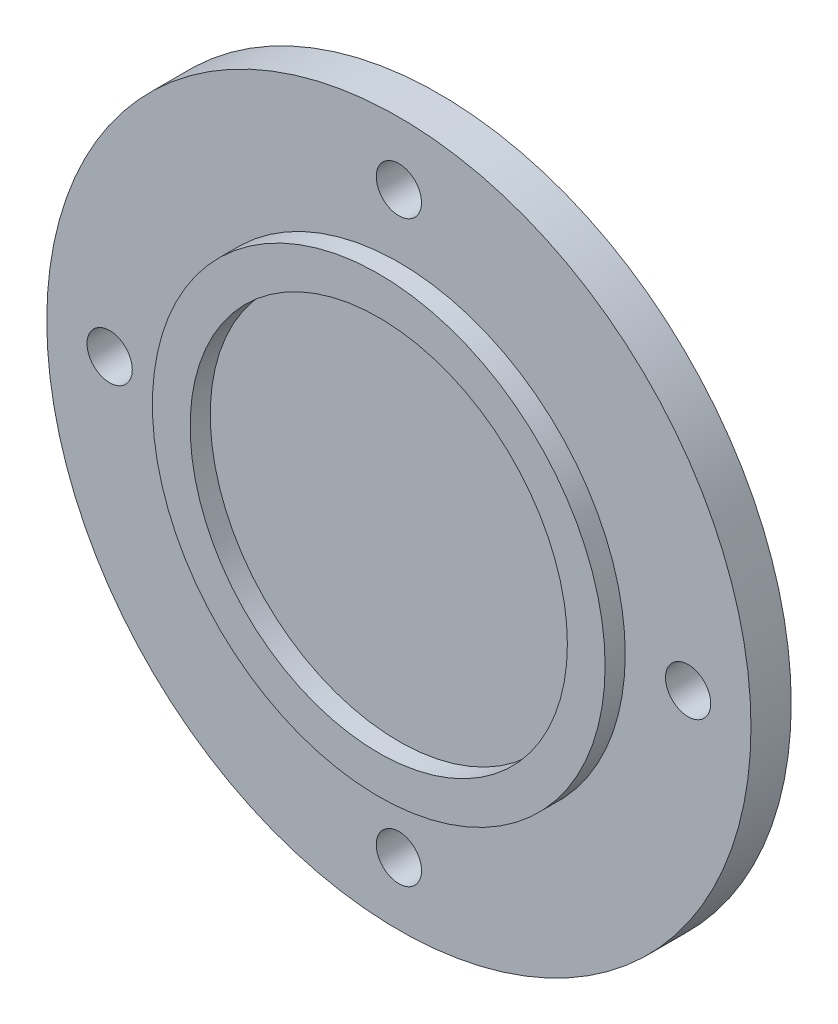
ISO-10303-21;
HEADER;
FILE_DESCRIPTION(('STEP AP214'),'2;1');
FILE_NAME('part.step','',(''),(''),'','','');
FILE_SCHEMA(('AUTOMOTIVE_DESIGN { 1 0 10303 214 1 1 1 1 }'));
ENDSEC;
DATA;
#1=APPLICATION_CONTEXT('core data for automotive mechanical design processes');
#2=APPLICATION_PROTOCOL_DEFINITION('international standard','automotive_design',2000,#1);
#3=PRODUCT_CONTEXT('',#1,'mechanical');
#4=PRODUCT('Part','Part','',(#3));
#5=PRODUCT_RELATED_PRODUCT_CATEGORY('part','',(#4));
#6=PRODUCT_DEFINITION_FORMATION('','',#4);
#7=PRODUCT_DEFINITION_CONTEXT('part definition',#1,'design');
#8=PRODUCT_DEFINITION('design','',#6,#7);
#9=PRODUCT_DEFINITION_SHAPE('','',#8);
#10=(LENGTH_UNIT() NAMED_UNIT(*) SI_UNIT(.MILLI.,.METRE.));
#11=(NAMED_UNIT(*) PLANE_ANGLE_UNIT() SI_UNIT($,.RADIAN.));
#12=(NAMED_UNIT(*) SI_UNIT($,.STERADIAN.) SOLID_ANGLE_UNIT());
#13=UNCERTAINTY_MEASURE_WITH_UNIT(LENGTH_MEASURE(1.E-05),#10,'distance_accuracy_value','');
#14=(GEOMETRIC_REPRESENTATION_CONTEXT(3) GLOBAL_UNCERTAINTY_ASSIGNED_CONTEXT((#13)) GLOBAL_UNIT_ASSIGNED_CONTEXT((#10,
#11,#12)) REPRESENTATION_CONTEXT('',''));
#15=CARTESIAN_POINT('',(0.,0.,0.));
#16=DIRECTION('',(0.,0.,1.));
#17=DIRECTION('',(1.,0.,0.));
#18=AXIS2_PLACEMENT_3D('',#15,#16,#17);
#19=CARTESIAN_POINT('',(0.,0.,12.));
#20=DIRECTION('',(0.,0.,-1.));
#21=DIRECTION('',(-1.,0.,0.));
#22=AXIS2_PLACEMENT_3D('',#19,#20,#21);
#23=CYLINDRICAL_SURFACE('',#22,70.);
#24=CARTESIAN_POINT('',(0.,0.,0.));
#25=DIRECTION('',(0.,0.,1.));
#26=DIRECTION('',(1.,0.,0.));
#27=AXIS2_PLACEMENT_3D('',#24,#25,#26);
#28=CIRCLE('',#27,70.);
#29=CARTESIAN_POINT('',(70.,0.,0.));
#30=VERTEX_POINT('',#29);
#31=EDGE_CURVE('E10',#30,#30,#28,.T.);
#32=ORIENTED_EDGE('',*,*,#31,.T.);
#33=EDGE_LOOP('',(#32));
#34=FACE_BOUND('',#33,.T.);
#35=CARTESIAN_POINT('',(0.,0.,8.));
#36=DIRECTION('',(0.,0.,1.));
#37=DIRECTION('',(1.,0.,0.));
#38=AXIS2_PLACEMENT_3D('',#35,#36,#37);
#39=CIRCLE('',#38,70.);
#40=CARTESIAN_POINT('',(70.,0.,8.));
#41=VERTEX_POINT('',#40);
#42=EDGE_CURVE('E63',#41,#41,#39,.T.);
#43=ORIENTED_EDGE('',*,*,#42,.F.);
#44=EDGE_LOOP('',(#43));
#45=FACE_BOUND('',#44,.T.);
#46=ADVANCED_FACE('F32',(#34,#45),#23,.T.);
#47=CARTESIAN_POINT('',(0.,57.5,12.));
#48=DIRECTION('',(0.,0.,-1.));
#49=DIRECTION('',(-1.,0.,0.));
#50=AXIS2_PLACEMENT_3D('',#47,#48,#49);
#51=CYLINDRICAL_SURFACE('',#50,4.5);
#52=CARTESIAN_POINT('',(0.,57.5,0.));
#53=DIRECTION('',(0.,0.,1.));
#54=DIRECTION('',(1.,0.,0.));
#55=AXIS2_PLACEMENT_3D('',#52,#53,#54);
#56=CIRCLE('',#55,4.5);
#57=CARTESIAN_POINT('',(4.5,57.5,0.));
#58=VERTEX_POINT('',#57);
#59=EDGE_CURVE('E39',#58,#58,#56,.T.);
#60=ORIENTED_EDGE('',*,*,#59,.F.);
#61=EDGE_LOOP('',(#60));
#62=FACE_BOUND('',#61,.T.);
#63=CARTESIAN_POINT('',(0.,57.5,8.));
#64=DIRECTION('',(0.,0.,1.));
#65=DIRECTION('',(1.,0.,0.));
#66=AXIS2_PLACEMENT_3D('',#63,#64,#65);
#67=CIRCLE('',#66,4.5);
#68=CARTESIAN_POINT('',(4.5,57.5,8.));
#69=VERTEX_POINT('',#68);
#70=EDGE_CURVE('E54',#69,#69,#67,.T.);
#71=ORIENTED_EDGE('',*,*,#70,.T.);
#72=EDGE_LOOP('',(#71));
#73=FACE_BOUND('',#72,.T.);
#74=ADVANCED_FACE('F105',(#62,#73),#51,.F.);
#75=CARTESIAN_POINT('',(57.5000000000016,1.62368571360558E-12,12.));
#76=DIRECTION('',(0.,0.,-1.));
#77=DIRECTION('',(-1.,0.,0.));
#78=AXIS2_PLACEMENT_3D('',#75,#76,#77);
#79=CYLINDRICAL_SURFACE('',#78,4.50000000000127);
#80=CARTESIAN_POINT('',(57.5000000000016,1.62368571360558E-12,0.));
#81=DIRECTION('',(0.,0.,1.));
#82=DIRECTION('',(1.,0.,0.));
#83=AXIS2_PLACEMENT_3D('',#80,#81,#82);
#84=CIRCLE('',#83,4.50000000000127);
#85=CARTESIAN_POINT('',(62.0000000000029,1.62368571360558E-12,0.));
#86=VERTEX_POINT('',#85);
#87=EDGE_CURVE('E43',#86,#86,#84,.T.);
#88=ORIENTED_EDGE('',*,*,#87,.F.);
#89=EDGE_LOOP('',(#88));
#90=FACE_BOUND('',#89,.T.);
#91=CARTESIAN_POINT('',(57.5000000000016,1.62368571360558E-12,8.));
#92=DIRECTION('',(0.,0.,1.));
#93=DIRECTION('',(1.,0.,0.));
#94=AXIS2_PLACEMENT_3D('',#91,#92,#93);
#95=CIRCLE('',#94,4.50000000000127);
#96=CARTESIAN_POINT('',(62.0000000000029,1.62368571360558E-12,8.));
#97=VERTEX_POINT('',#96);
#98=EDGE_CURVE('E57',#97,#97,#95,.T.);
#99=ORIENTED_EDGE('',*,*,#98,.T.);
#100=EDGE_LOOP('',(#99));
#101=FACE_BOUND('',#100,.T.);
#102=ADVANCED_FACE('F109',(#90,#101),#79,.F.);
#103=CARTESIAN_POINT('',(3.24737142721117E-12,-57.5,12.));
#104=DIRECTION('',(0.,0.,-1.));
#105=DIRECTION('',(-1.,0.,0.));
#106=AXIS2_PLACEMENT_3D('',#103,#104,#105);
#107=CYLINDRICAL_SURFACE('',#106,4.50000000000349);
#108=CARTESIAN_POINT('',(3.24737142721117E-12,-57.5,0.));
#109=DIRECTION('',(0.,0.,1.));
#110=DIRECTION('',(1.,0.,0.));
#111=AXIS2_PLACEMENT_3D('',#108,#109,#110);
#112=CIRCLE('',#111,4.50000000000349);
#113=CARTESIAN_POINT('',(4.50000000000674,-57.5,0.));
#114=VERTEX_POINT('',#113);
#115=EDGE_CURVE('E48',#114,#114,#112,.T.);
#116=ORIENTED_EDGE('',*,*,#115,.F.);
#117=EDGE_LOOP('',(#116));
#118=FACE_BOUND('',#117,.T.);
#119=CARTESIAN_POINT('',(3.24737142721117E-12,-57.5,8.));
#120=DIRECTION('',(0.,0.,1.));
#121=DIRECTION('',(1.,0.,0.));
#122=AXIS2_PLACEMENT_3D('',#119,#120,#121);
#123=CIRCLE('',#122,4.50000000000349);
#124=CARTESIAN_POINT('',(4.50000000000674,-57.5,8.));
#125=VERTEX_POINT('',#124);
#126=EDGE_CURVE('E60',#125,#125,#123,.T.);
#127=ORIENTED_EDGE('',*,*,#126,.T.);
#128=EDGE_LOOP('',(#127));
#129=FACE_BOUND('',#128,.T.);
#130=ADVANCED_FACE('F118',(#118,#129),#107,.F.);
#131=CARTESIAN_POINT('',(-57.4999999999984,-1.63072743270068E-12,12.));
#132=DIRECTION('',(0.,0.,-1.));
#133=DIRECTION('',(-1.,0.,0.));
#134=AXIS2_PLACEMENT_3D('',#131,#132,#133);
#135=CYLINDRICAL_SURFACE('',#134,4.50000000000261);
#136=CARTESIAN_POINT('',(-57.4999999999984,-1.63072743270068E-12,0.));
#137=DIRECTION('',(0.,0.,1.));
#138=DIRECTION('',(1.,0.,0.));
#139=AXIS2_PLACEMENT_3D('',#136,#137,#138);
#140=CIRCLE('',#139,4.50000000000261);
#141=CARTESIAN_POINT('',(-52.9999999999958,-1.63072743270068E-12,0.));
#142=VERTEX_POINT('',#141);
#143=EDGE_CURVE('E51',#142,#142,#140,.T.);
#144=ORIENTED_EDGE('',*,*,#143,.F.);
#145=EDGE_LOOP('',(#144));
#146=FACE_BOUND('',#145,.T.);
#147=CARTESIAN_POINT('',(-57.4999999999984,-1.63072743270068E-12,8.));
#148=DIRECTION('',(0.,0.,1.));
#149=DIRECTION('',(1.,0.,0.));
#150=AXIS2_PLACEMENT_3D('',#147,#148,#149);
#151=CIRCLE('',#150,4.50000000000261);
#152=CARTESIAN_POINT('',(-52.9999999999958,-1.63072743270068E-12,8.));
#153=VERTEX_POINT('',#152);
#154=EDGE_CURVE('E35',#153,#153,#151,.T.);
#155=ORIENTED_EDGE('',*,*,#154,.T.);
#156=EDGE_LOOP('',(#155));
#157=FACE_BOUND('',#156,.T.);
#158=ADVANCED_FACE('F125',(#146,#157),#135,.F.);
#159=CARTESIAN_POINT('',(0.,0.,0.));
#160=DIRECTION('',(0.,0.,1.));
#161=DIRECTION('',(1.,0.,0.));
#162=AXIS2_PLACEMENT_3D('',#159,#160,#161);
#163=PLANE('',#162);
#164=ORIENTED_EDGE('',*,*,#31,.F.);
#165=EDGE_LOOP('',(#164));
#166=FACE_BOUND('',#165,.T.);
#167=ORIENTED_EDGE('',*,*,#59,.T.);
#168=EDGE_LOOP('',(#167));
#169=FACE_BOUND('',#168,.T.);
#170=ORIENTED_EDGE('',*,*,#87,.T.);
#171=EDGE_LOOP('',(#170));
#172=FACE_BOUND('',#171,.T.);
#173=ORIENTED_EDGE('',*,*,#115,.T.);
#174=EDGE_LOOP('',(#173));
#175=FACE_BOUND('',#174,.T.);
#176=ORIENTED_EDGE('',*,*,#143,.T.);
#177=EDGE_LOOP('',(#176));
#178=FACE_BOUND('',#177,.T.);
#179=ADVANCED_FACE('F101',(#166,#169,#172,#175,#178),#163,.F.);
#180=CARTESIAN_POINT('',(0.,0.,8.));
#181=DIRECTION('',(0.,0.,1.));
#182=DIRECTION('',(1.,0.,0.));
#183=AXIS2_PLACEMENT_3D('',#180,#181,#182);
#184=PLANE('',#183);
#185=ORIENTED_EDGE('',*,*,#70,.F.);
#186=EDGE_LOOP('',(#185));
#187=FACE_BOUND('',#186,.T.);
#188=ORIENTED_EDGE('',*,*,#98,.F.);
#189=EDGE_LOOP('',(#188));
#190=FACE_BOUND('',#189,.T.);
#191=ORIENTED_EDGE('',*,*,#126,.F.);
#192=EDGE_LOOP('',(#191));
#193=FACE_BOUND('',#192,.T.);
#194=ORIENTED_EDGE('',*,*,#154,.F.);
#195=EDGE_LOOP('',(#194));
#196=FACE_BOUND('',#195,.T.);
#197=CARTESIAN_POINT('',(0.,0.,8.));
#198=DIRECTION('',(0.,0.,1.));
#199=DIRECTION('',(1.,0.,0.));
#200=AXIS2_PLACEMENT_3D('',#197,#198,#199);
#201=CIRCLE('',#200,45.);
#202=CARTESIAN_POINT('',(45.,0.,8.));
#203=VERTEX_POINT('',#202);
#204=EDGE_CURVE('E66',#203,#203,#201,.T.);
#205=ORIENTED_EDGE('',*,*,#204,.F.);
#206=EDGE_LOOP('',(#205));
#207=FACE_BOUND('',#206,.T.);
#208=ORIENTED_EDGE('',*,*,#42,.T.);
#209=EDGE_LOOP('',(#208));
#210=FACE_BOUND('',#209,.T.);
#211=ADVANCED_FACE('F95',(#187,#190,#193,#196,#207,#210),#184,.T.);
#212=CARTESIAN_POINT('',(0.,0.,8.));
#213=DIRECTION('',(0.,0.,1.));
#214=DIRECTION('',(1.,0.,0.));
#215=AXIS2_PLACEMENT_3D('',#212,#213,#214);
#216=CYLINDRICAL_SURFACE('',#215,45.);
#217=ORIENTED_EDGE('',*,*,#204,.T.);
#218=EDGE_LOOP('',(#217));
#219=FACE_BOUND('',#218,.T.);
#220=CARTESIAN_POINT('',(0.,0.,12.));
#221=DIRECTION('',(0.,0.,1.));
#222=DIRECTION('',(1.,0.,0.));
#223=AXIS2_PLACEMENT_3D('',#220,#221,#222);
#224=CIRCLE('',#223,45.);
#225=CARTESIAN_POINT('',(45.,0.,12.));
#226=VERTEX_POINT('',#225);
#227=EDGE_CURVE('E67',#226,#226,#224,.T.);
#228=ORIENTED_EDGE('',*,*,#227,.F.);
#229=EDGE_LOOP('',(#228));
#230=FACE_BOUND('',#229,.T.);
#231=ADVANCED_FACE('F90',(#219,#230),#216,.T.);
#232=CARTESIAN_POINT('',(0.,0.,12.));
#233=DIRECTION('',(0.,0.,1.));
#234=DIRECTION('',(1.,0.,0.));
#235=AXIS2_PLACEMENT_3D('',#232,#233,#234);
#236=PLANE('',#235);
#237=CARTESIAN_POINT('',(0.,0.,12.));
#238=DIRECTION('',(0.,0.,1.));
#239=DIRECTION('',(1.,0.,0.));
#240=AXIS2_PLACEMENT_3D('',#237,#238,#239);
#241=CIRCLE('',#240,37.5);
#242=CARTESIAN_POINT('',(37.5,0.,12.));
#243=VERTEX_POINT('',#242);
#244=EDGE_CURVE('E73',#243,#243,#241,.T.);
#245=ORIENTED_EDGE('',*,*,#244,.F.);
#246=EDGE_LOOP('',(#245));
#247=FACE_BOUND('',#246,.T.);
#248=ORIENTED_EDGE('',*,*,#227,.T.);
#249=EDGE_LOOP('',(#248));
#250=FACE_BOUND('',#249,.T.);
#251=ADVANCED_FACE('F84',(#247,#250),#236,.T.);
#252=CARTESIAN_POINT('',(0.,0.,8.));
#253=DIRECTION('',(0.,0.,1.));
#254=DIRECTION('',(1.,0.,0.));
#255=AXIS2_PLACEMENT_3D('',#252,#253,#254);
#256=CYLINDRICAL_SURFACE('',#255,37.5);
#257=CARTESIAN_POINT('',(0.,0.,8.));
#258=DIRECTION('',(0.,0.,1.));
#259=DIRECTION('',(1.,0.,0.));
#260=AXIS2_PLACEMENT_3D('',#257,#258,#259);
#261=CIRCLE('',#260,37.5);
#262=CARTESIAN_POINT('',(37.5,0.,8.));
#263=VERTEX_POINT('',#262);
#264=EDGE_CURVE('E70',#263,#263,#261,.T.);
#265=ORIENTED_EDGE('',*,*,#264,.F.);
#266=EDGE_LOOP('',(#265));
#267=FACE_BOUND('',#266,.T.);
#268=ORIENTED_EDGE('',*,*,#244,.T.);
#269=EDGE_LOOP('',(#268));
#270=FACE_BOUND('',#269,.T.);
#271=ADVANCED_FACE('F81',(#267,#270),#256,.F.);
#272=CARTESIAN_POINT('',(0.,0.,8.));
#273=DIRECTION('',(0.,0.,1.));
#274=DIRECTION('',(1.,0.,0.));
#275=AXIS2_PLACEMENT_3D('',#272,#273,#274);
#276=PLANE('',#275);
#277=ORIENTED_EDGE('',*,*,#264,.T.);
#278=EDGE_LOOP('',(#277));
#279=FACE_BOUND('',#278,.T.);
#280=ADVANCED_FACE('F79',(#279),#276,.T.);
#281=CLOSED_SHELL('',(#46,#74,#102,#130,#158,#179,#211,#231,#251,#271,#280));
#282=MANIFOLD_SOLID_BREP('B2',#281);
#283=ADVANCED_BREP_SHAPE_REPRESENTATION('',(#18,#282),#14);
#284=SHAPE_DEFINITION_REPRESENTATION(#9,#283);
ENDSEC;
END-ISO-10303-21;
